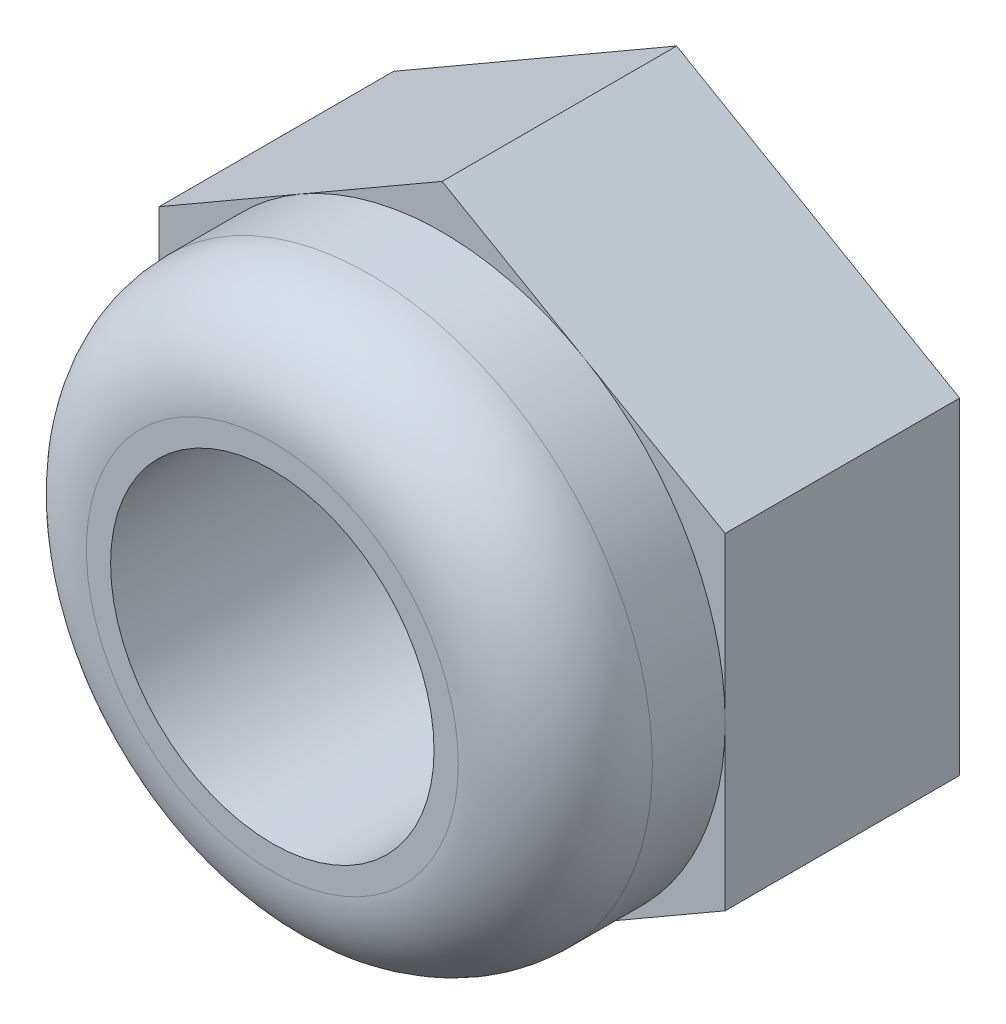
ISO-10303-21;
HEADER;
FILE_DESCRIPTION(('STEP AP214'),'2;1');
FILE_NAME('part.step','',(''),(''),'','','');
FILE_SCHEMA(('AUTOMOTIVE_DESIGN { 1 0 10303 214 1 1 1 1 }'));
ENDSEC;
DATA;
#1=APPLICATION_CONTEXT('core data for automotive mechanical design processes');
#2=APPLICATION_PROTOCOL_DEFINITION('international standard','automotive_design',2000,#1);
#3=PRODUCT_CONTEXT('',#1,'mechanical');
#4=PRODUCT('Part','Part','',(#3));
#5=PRODUCT_RELATED_PRODUCT_CATEGORY('part','',(#4));
#6=PRODUCT_DEFINITION_FORMATION('','',#4);
#7=PRODUCT_DEFINITION_CONTEXT('part definition',#1,'design');
#8=PRODUCT_DEFINITION('design','',#6,#7);
#9=PRODUCT_DEFINITION_SHAPE('','',#8);
#10=(LENGTH_UNIT() NAMED_UNIT(*) SI_UNIT(.MILLI.,.METRE.));
#11=(NAMED_UNIT(*) PLANE_ANGLE_UNIT() SI_UNIT($,.RADIAN.));
#12=(NAMED_UNIT(*) SI_UNIT($,.STERADIAN.) SOLID_ANGLE_UNIT());
#13=UNCERTAINTY_MEASURE_WITH_UNIT(LENGTH_MEASURE(1.E-05),#10,'distance_accuracy_value','');
#14=(GEOMETRIC_REPRESENTATION_CONTEXT(3) GLOBAL_UNCERTAINTY_ASSIGNED_CONTEXT((#13)) GLOBAL_UNIT_ASSIGNED_CONTEXT((#10,
#11,#12)) REPRESENTATION_CONTEXT('',''));
#15=CARTESIAN_POINT('',(0.,0.,0.));
#16=DIRECTION('',(0.,0.,1.));
#17=DIRECTION('',(1.,0.,0.));
#18=AXIS2_PLACEMENT_3D('',#15,#16,#17);
#19=CARTESIAN_POINT('',(0.,0.,2.9));
#20=DIRECTION('',(0.,0.,1.));
#21=DIRECTION('',(1.,0.,0.));
#22=AXIS2_PLACEMENT_3D('',#19,#20,#21);
#23=PLANE('',#22);
#24=CARTESIAN_POINT('',(0.,0.,2.9));
#25=DIRECTION('',(0.,0.,1.));
#26=DIRECTION('',(1.,0.,0.));
#27=AXIS2_PLACEMENT_3D('',#24,#25,#26);
#28=CIRCLE('',#27,3.5);
#29=CARTESIAN_POINT('',(3.5,0.,2.9));
#30=VERTEX_POINT('',#29);
#31=CARTESIAN_POINT('',(1.75,3.03108891324554,2.9));
#32=VERTEX_POINT('',#31);
#33=EDGE_CURVE('E132',#30,#32,#28,.T.);
#34=ORIENTED_EDGE('',*,*,#33,.F.);
#35=DIRECTION('',(0.,1.,0.));
#36=VECTOR('',#35,1.);
#37=CARTESIAN_POINT('',(3.5,-2.02072594216369,2.9));
#38=LINE('',#37,#36);
#39=CARTESIAN_POINT('',(3.5,2.02072594216369,2.9));
#40=VERTEX_POINT('',#39);
#41=EDGE_CURVE('E120',#30,#40,#38,.T.);
#42=ORIENTED_EDGE('',*,*,#41,.T.);
#43=DIRECTION('',(-0.866025403784439,0.5,0.));
#44=VECTOR('',#43,1.);
#45=CARTESIAN_POINT('',(3.5,2.02072594216369,2.9));
#46=LINE('',#45,#44);
#47=EDGE_CURVE('E133',#40,#32,#46,.T.);
#48=ORIENTED_EDGE('',*,*,#47,.T.);
#49=EDGE_LOOP('',(#34,#42,#48));
#50=FACE_BOUND('',#49,.T.);
#51=ADVANCED_FACE('F37',(#50),#23,.T.);
#52=CARTESIAN_POINT('',(-1.75,3.03108891324554,2.9));
#53=VERTEX_POINT('',#52);
#54=EDGE_CURVE('E139',#32,#53,#28,.T.);
#55=ORIENTED_EDGE('',*,*,#54,.F.);
#56=CARTESIAN_POINT('',(0.,4.04145188432738,2.9));
#57=VERTEX_POINT('',#56);
#58=EDGE_CURVE('E119',#32,#57,#46,.T.);
#59=ORIENTED_EDGE('',*,*,#58,.T.);
#60=DIRECTION('',(-0.866025403784439,-0.5,0.));
#61=VECTOR('',#60,1.);
#62=CARTESIAN_POINT('',(0.,4.04145188432738,2.9));
#63=LINE('',#62,#61);
#64=EDGE_CURVE('E150',#57,#53,#63,.T.);
#65=ORIENTED_EDGE('',*,*,#64,.T.);
#66=EDGE_LOOP('',(#55,#59,#65));
#67=FACE_BOUND('',#66,.T.);
#68=ADVANCED_FACE('F198',(#67),#23,.T.);
#69=CARTESIAN_POINT('',(-3.5,0.,2.9));
#70=VERTEX_POINT('',#69);
#71=EDGE_CURVE('E187',#53,#70,#28,.T.);
#72=ORIENTED_EDGE('',*,*,#71,.F.);
#73=CARTESIAN_POINT('',(-3.5,2.02072594216369,2.9));
#74=VERTEX_POINT('',#73);
#75=EDGE_CURVE('E149',#53,#74,#63,.T.);
#76=ORIENTED_EDGE('',*,*,#75,.T.);
#77=DIRECTION('',(0.,-1.,0.));
#78=VECTOR('',#77,1.);
#79=CARTESIAN_POINT('',(-3.5,2.02072594216369,2.9));
#80=LINE('',#79,#78);
#81=EDGE_CURVE('E154',#74,#70,#80,.T.);
#82=ORIENTED_EDGE('',*,*,#81,.T.);
#83=EDGE_LOOP('',(#72,#76,#82));
#84=FACE_BOUND('',#83,.T.);
#85=ADVANCED_FACE('F191',(#84),#23,.T.);
#86=CARTESIAN_POINT('',(-1.75,-3.03108891324554,2.9));
#87=VERTEX_POINT('',#86);
#88=EDGE_CURVE('E60',#70,#87,#28,.T.);
#89=ORIENTED_EDGE('',*,*,#88,.F.);
#90=CARTESIAN_POINT('',(-3.5,-2.02072594216369,2.9));
#91=VERTEX_POINT('',#90);
#92=EDGE_CURVE('E153',#70,#91,#80,.T.);
#93=ORIENTED_EDGE('',*,*,#92,.T.);
#94=DIRECTION('',(0.866025403784438,-0.5,0.));
#95=VECTOR('',#94,1.);
#96=CARTESIAN_POINT('',(-3.5,-2.02072594216369,2.9));
#97=LINE('',#96,#95);
#98=EDGE_CURVE('E158',#91,#87,#97,.T.);
#99=ORIENTED_EDGE('',*,*,#98,.T.);
#100=EDGE_LOOP('',(#89,#93,#99));
#101=FACE_BOUND('',#100,.T.);
#102=ADVANCED_FACE('F217',(#101),#23,.T.);
#103=CARTESIAN_POINT('',(1.75,-3.03108891324553,2.9));
#104=VERTEX_POINT('',#103);
#105=EDGE_CURVE('E52',#87,#104,#28,.T.);
#106=ORIENTED_EDGE('',*,*,#105,.F.);
#107=CARTESIAN_POINT('',(0.,-4.04145188432738,2.9));
#108=VERTEX_POINT('',#107);
#109=EDGE_CURVE('E157',#87,#108,#97,.T.);
#110=ORIENTED_EDGE('',*,*,#109,.T.);
#111=DIRECTION('',(0.866025403784438,0.5,0.));
#112=VECTOR('',#111,1.);
#113=CARTESIAN_POINT('',(0.,-4.04145188432738,2.9));
#114=LINE('',#113,#112);
#115=EDGE_CURVE('E130',#108,#104,#114,.T.);
#116=ORIENTED_EDGE('',*,*,#115,.T.);
#117=EDGE_LOOP('',(#106,#110,#116));
#118=FACE_BOUND('',#117,.T.);
#119=ADVANCED_FACE('F219',(#118),#23,.T.);
#120=CARTESIAN_POINT('',(0.,-4.04145188432738,2.9));
#121=DIRECTION('',(-0.5,0.866025403784439,0.));
#122=DIRECTION('',(-0.866025403784439,-0.5,0.));
#123=AXIS2_PLACEMENT_3D('',#120,#121,#122);
#124=PLANE('',#123);
#125=DIRECTION('',(0.866025403784438,0.5,0.));
#126=VECTOR('',#125,1.);
#127=CARTESIAN_POINT('',(0.,-4.04145188432738,0.));
#128=LINE('',#127,#126);
#129=CARTESIAN_POINT('',(0.,-4.04145188432738,0.));
#130=VERTEX_POINT('',#129);
#131=CARTESIAN_POINT('',(3.5,-2.02072594216369,0.));
#132=VERTEX_POINT('',#131);
#133=EDGE_CURVE('E136',#130,#132,#128,.T.);
#134=ORIENTED_EDGE('',*,*,#133,.T.);
#135=DIRECTION('',(0.,0.,-1.));
#136=VECTOR('',#135,1.);
#137=CARTESIAN_POINT('',(3.5,-2.02072594216369,2.9));
#138=LINE('',#137,#136);
#139=CARTESIAN_POINT('',(3.5,-2.02072594216369,2.9));
#140=VERTEX_POINT('',#139);
#141=EDGE_CURVE('E141',#140,#132,#138,.T.);
#142=ORIENTED_EDGE('',*,*,#141,.F.);
#143=EDGE_CURVE('E115',#104,#140,#114,.T.);
#144=ORIENTED_EDGE('',*,*,#143,.F.);
#145=ORIENTED_EDGE('',*,*,#115,.F.);
#146=DIRECTION('',(0.,0.,-1.));
#147=VECTOR('',#146,1.);
#148=CARTESIAN_POINT('',(0.,-4.04145188432738,2.9));
#149=LINE('',#148,#147);
#150=EDGE_CURVE('E160',#108,#130,#149,.T.);
#151=ORIENTED_EDGE('',*,*,#150,.T.);
#152=EDGE_LOOP('',(#134,#142,#144,#145,#151));
#153=FACE_BOUND('',#152,.T.);
#154=ADVANCED_FACE('F225',(#153),#124,.F.);
#155=CARTESIAN_POINT('',(3.5,-2.02072594216369,2.9));
#156=DIRECTION('',(-1.,0.,0.));
#157=DIRECTION('',(0.,-1.,0.));
#158=AXIS2_PLACEMENT_3D('',#155,#156,#157);
#159=PLANE('',#158);
#160=DIRECTION('',(0.,1.,0.));
#161=VECTOR('',#160,1.);
#162=CARTESIAN_POINT('',(3.5,-2.02072594216369,0.));
#163=LINE('',#162,#161);
#164=CARTESIAN_POINT('',(3.5,2.02072594216369,0.));
#165=VERTEX_POINT('',#164);
#166=EDGE_CURVE('E163',#132,#165,#163,.T.);
#167=ORIENTED_EDGE('',*,*,#166,.T.);
#168=DIRECTION('',(0.,0.,-1.));
#169=VECTOR('',#168,1.);
#170=CARTESIAN_POINT('',(3.5,2.02072594216369,2.9));
#171=LINE('',#170,#169);
#172=EDGE_CURVE('E126',#40,#165,#171,.T.);
#173=ORIENTED_EDGE('',*,*,#172,.F.);
#174=ORIENTED_EDGE('',*,*,#41,.F.);
#175=EDGE_CURVE('E109',#140,#30,#38,.T.);
#176=ORIENTED_EDGE('',*,*,#175,.F.);
#177=ORIENTED_EDGE('',*,*,#141,.T.);
#178=EDGE_LOOP('',(#167,#173,#174,#176,#177));
#179=FACE_BOUND('',#178,.T.);
#180=ADVANCED_FACE('F124',(#179),#159,.F.);
#181=CARTESIAN_POINT('',(3.5,2.02072594216369,2.9));
#182=DIRECTION('',(-0.5,-0.866025403784439,0.));
#183=DIRECTION('',(0.866025403784439,-0.5,0.));
#184=AXIS2_PLACEMENT_3D('',#181,#182,#183);
#185=PLANE('',#184);
#186=DIRECTION('',(-0.866025403784439,0.5,0.));
#187=VECTOR('',#186,1.);
#188=CARTESIAN_POINT('',(3.5,2.02072594216369,0.));
#189=LINE('',#188,#187);
#190=CARTESIAN_POINT('',(0.,4.04145188432738,0.));
#191=VERTEX_POINT('',#190);
#192=EDGE_CURVE('E165',#165,#191,#189,.T.);
#193=ORIENTED_EDGE('',*,*,#192,.T.);
#194=DIRECTION('',(0.,0.,-1.));
#195=VECTOR('',#194,1.);
#196=CARTESIAN_POINT('',(0.,4.04145188432738,2.9));
#197=LINE('',#196,#195);
#198=EDGE_CURVE('E181',#57,#191,#197,.T.);
#199=ORIENTED_EDGE('',*,*,#198,.F.);
#200=ORIENTED_EDGE('',*,*,#58,.F.);
#201=ORIENTED_EDGE('',*,*,#47,.F.);
#202=ORIENTED_EDGE('',*,*,#172,.T.);
#203=EDGE_LOOP('',(#193,#199,#200,#201,#202));
#204=FACE_BOUND('',#203,.T.);
#205=ADVANCED_FACE('F202',(#204),#185,.F.);
#206=CARTESIAN_POINT('',(0.,4.04145188432738,2.9));
#207=DIRECTION('',(0.5,-0.866025403784439,0.));
#208=DIRECTION('',(0.866025403784439,0.5,0.));
#209=AXIS2_PLACEMENT_3D('',#206,#207,#208);
#210=PLANE('',#209);
#211=DIRECTION('',(-0.866025403784439,-0.5,0.));
#212=VECTOR('',#211,1.);
#213=CARTESIAN_POINT('',(0.,4.04145188432738,0.));
#214=LINE('',#213,#212);
#215=CARTESIAN_POINT('',(-3.5,2.02072594216369,0.));
#216=VERTEX_POINT('',#215);
#217=EDGE_CURVE('E167',#191,#216,#214,.T.);
#218=ORIENTED_EDGE('',*,*,#217,.T.);
#219=DIRECTION('',(0.,0.,-1.));
#220=VECTOR('',#219,1.);
#221=CARTESIAN_POINT('',(-3.5,2.02072594216369,2.9));
#222=LINE('',#221,#220);
#223=EDGE_CURVE('E178',#74,#216,#222,.T.);
#224=ORIENTED_EDGE('',*,*,#223,.F.);
#225=ORIENTED_EDGE('',*,*,#75,.F.);
#226=ORIENTED_EDGE('',*,*,#64,.F.);
#227=ORIENTED_EDGE('',*,*,#198,.T.);
#228=EDGE_LOOP('',(#218,#224,#225,#226,#227));
#229=FACE_BOUND('',#228,.T.);
#230=ADVANCED_FACE('F196',(#229),#210,.F.);
#231=CARTESIAN_POINT('',(-3.5,2.02072594216369,2.9));
#232=DIRECTION('',(1.,0.,0.));
#233=DIRECTION('',(0.,1.,0.));
#234=AXIS2_PLACEMENT_3D('',#231,#232,#233);
#235=PLANE('',#234);
#236=DIRECTION('',(0.,-1.,0.));
#237=VECTOR('',#236,1.);
#238=CARTESIAN_POINT('',(-3.5,2.02072594216369,0.));
#239=LINE('',#238,#237);
#240=CARTESIAN_POINT('',(-3.5,-2.02072594216369,0.));
#241=VERTEX_POINT('',#240);
#242=EDGE_CURVE('E169',#216,#241,#239,.T.);
#243=ORIENTED_EDGE('',*,*,#242,.T.);
#244=DIRECTION('',(0.,0.,-1.));
#245=VECTOR('',#244,1.);
#246=CARTESIAN_POINT('',(-3.5,-2.02072594216369,2.9));
#247=LINE('',#246,#245);
#248=EDGE_CURVE('E175',#91,#241,#247,.T.);
#249=ORIENTED_EDGE('',*,*,#248,.F.);
#250=ORIENTED_EDGE('',*,*,#92,.F.);
#251=ORIENTED_EDGE('',*,*,#81,.F.);
#252=ORIENTED_EDGE('',*,*,#223,.T.);
#253=EDGE_LOOP('',(#243,#249,#250,#251,#252));
#254=FACE_BOUND('',#253,.T.);
#255=ADVANCED_FACE('F212',(#254),#235,.F.);
#256=CARTESIAN_POINT('',(-3.5,-2.02072594216369,2.9));
#257=DIRECTION('',(0.5,0.866025403784439,0.));
#258=DIRECTION('',(-0.866025403784439,0.5,0.));
#259=AXIS2_PLACEMENT_3D('',#256,#257,#258);
#260=PLANE('',#259);
#261=DIRECTION('',(0.866025403784438,-0.5,0.));
#262=VECTOR('',#261,1.);
#263=CARTESIAN_POINT('',(-3.5,-2.02072594216369,0.));
#264=LINE('',#263,#262);
#265=EDGE_CURVE('E171',#241,#130,#264,.T.);
#266=ORIENTED_EDGE('',*,*,#265,.T.);
#267=ORIENTED_EDGE('',*,*,#150,.F.);
#268=ORIENTED_EDGE('',*,*,#109,.F.);
#269=ORIENTED_EDGE('',*,*,#98,.F.);
#270=ORIENTED_EDGE('',*,*,#248,.T.);
#271=EDGE_LOOP('',(#266,#267,#268,#269,#270));
#272=FACE_BOUND('',#271,.T.);
#273=ADVANCED_FACE('F215',(#272),#260,.F.);
#274=EDGE_CURVE('E113',#104,#30,#28,.T.);
#275=ORIENTED_EDGE('',*,*,#274,.F.);
#276=ORIENTED_EDGE('',*,*,#143,.T.);
#277=ORIENTED_EDGE('',*,*,#175,.T.);
#278=EDGE_LOOP('',(#275,#276,#277));
#279=FACE_BOUND('',#278,.T.);
#280=ADVANCED_FACE('F111',(#279),#23,.T.);
#281=CARTESIAN_POINT('',(0.,0.,0.));
#282=DIRECTION('',(0.,0.,1.));
#283=DIRECTION('',(1.,0.,0.));
#284=AXIS2_PLACEMENT_3D('',#281,#282,#283);
#285=PLANE('',#284);
#286=CARTESIAN_POINT('',(0.,0.,0.));
#287=DIRECTION('',(0.,0.,1.));
#288=DIRECTION('',(1.,0.,0.));
#289=AXIS2_PLACEMENT_3D('',#286,#287,#288);
#290=CIRCLE('',#289,2.);
#291=CARTESIAN_POINT('',(2.,0.,0.));
#292=VERTEX_POINT('',#291);
#293=EDGE_CURVE('E137',#292,#292,#290,.T.);
#294=ORIENTED_EDGE('',*,*,#293,.T.);
#295=EDGE_LOOP('',(#294));
#296=FACE_BOUND('',#295,.T.);
#297=ORIENTED_EDGE('',*,*,#133,.F.);
#298=ORIENTED_EDGE('',*,*,#265,.F.);
#299=ORIENTED_EDGE('',*,*,#242,.F.);
#300=ORIENTED_EDGE('',*,*,#217,.F.);
#301=ORIENTED_EDGE('',*,*,#192,.F.);
#302=ORIENTED_EDGE('',*,*,#166,.F.);
#303=EDGE_LOOP('',(#297,#298,#299,#300,#301,#302));
#304=FACE_BOUND('',#303,.T.);
#305=ADVANCED_FACE('F208',(#296,#304),#285,.F.);
#306=CARTESIAN_POINT('',(0.,0.,5.));
#307=DIRECTION('',(0.,0.,-1.));
#308=DIRECTION('',(-1.,0.,0.));
#309=AXIS2_PLACEMENT_3D('',#306,#307,#308);
#310=CYLINDRICAL_SURFACE('',#309,3.5);
#311=CARTESIAN_POINT('',(0.,0.,3.8));
#312=DIRECTION('',(0.,0.,1.));
#313=DIRECTION('',(1.,0.,0.));
#314=AXIS2_PLACEMENT_3D('',#311,#312,#313);
#315=CIRCLE('',#314,3.5);
#316=CARTESIAN_POINT('',(3.5,0.,3.8));
#317=VERTEX_POINT('',#316);
#318=EDGE_CURVE('E11',#317,#317,#315,.F.);
#319=ORIENTED_EDGE('',*,*,#318,.T.);
#320=EDGE_LOOP('',(#319));
#321=FACE_BOUND('',#320,.T.);
#322=ORIENTED_EDGE('',*,*,#33,.T.);
#323=ORIENTED_EDGE('',*,*,#54,.T.);
#324=ORIENTED_EDGE('',*,*,#71,.T.);
#325=ORIENTED_EDGE('',*,*,#88,.T.);
#326=ORIENTED_EDGE('',*,*,#105,.T.);
#327=ORIENTED_EDGE('',*,*,#274,.T.);
#328=EDGE_LOOP('',(#322,#323,#324,#325,#326,#327));
#329=FACE_BOUND('',#328,.T.);
#330=ADVANCED_FACE('F140',(#321,#329),#310,.T.);
#331=CARTESIAN_POINT('',(0.,0.,5.));
#332=DIRECTION('',(0.,0.,1.));
#333=DIRECTION('',(1.,0.,0.));
#334=AXIS2_PLACEMENT_3D('',#331,#332,#333);
#335=PLANE('',#334);
#336=CARTESIAN_POINT('',(0.,0.,5.));
#337=DIRECTION('',(0.,0.,1.));
#338=DIRECTION('',(1.,0.,0.));
#339=AXIS2_PLACEMENT_3D('',#336,#337,#338);
#340=CIRCLE('',#339,2.3);
#341=CARTESIAN_POINT('',(2.3,0.,5.));
#342=VERTEX_POINT('',#341);
#343=EDGE_CURVE('E45',#342,#342,#340,.T.);
#344=ORIENTED_EDGE('',*,*,#343,.T.);
#345=EDGE_LOOP('',(#344));
#346=FACE_BOUND('',#345,.T.);
#347=CARTESIAN_POINT('',(0.,0.,5.));
#348=DIRECTION('',(0.,0.,1.));
#349=DIRECTION('',(1.,0.,0.));
#350=AXIS2_PLACEMENT_3D('',#347,#348,#349);
#351=CIRCLE('',#350,2.);
#352=CARTESIAN_POINT('',(2.,0.,5.));
#353=VERTEX_POINT('',#352);
#354=EDGE_CURVE('E145',#353,#353,#351,.T.);
#355=ORIENTED_EDGE('',*,*,#354,.F.);
#356=EDGE_LOOP('',(#355));
#357=FACE_BOUND('',#356,.T.);
#358=ADVANCED_FACE('F298',(#346,#357),#335,.T.);
#359=CARTESIAN_POINT('',(0.,0.,0.));
#360=DIRECTION('',(0.,0.,1.));
#361=DIRECTION('',(1.,0.,0.));
#362=AXIS2_PLACEMENT_3D('',#359,#360,#361);
#363=CYLINDRICAL_SURFACE('',#362,2.);
#364=ORIENTED_EDGE('',*,*,#293,.F.);
#365=EDGE_LOOP('',(#364));
#366=FACE_BOUND('',#365,.T.);
#367=ORIENTED_EDGE('',*,*,#354,.T.);
#368=EDGE_LOOP('',(#367));
#369=FACE_BOUND('',#368,.T.);
#370=ADVANCED_FACE('F293',(#366,#369),#363,.F.);
#371=CARTESIAN_POINT('',(0.,0.,3.8));
#372=DIRECTION('',(0.,0.,1.));
#373=DIRECTION('',(1.,0.,0.));
#374=AXIS2_PLACEMENT_3D('',#371,#372,#373);
#375=TOROIDAL_SURFACE('',#374,2.3,1.2);
#376=ORIENTED_EDGE('',*,*,#318,.F.);
#377=EDGE_LOOP('',(#376));
#378=FACE_BOUND('',#377,.T.);
#379=ORIENTED_EDGE('',*,*,#343,.F.);
#380=EDGE_LOOP('',(#379));
#381=FACE_BOUND('',#380,.T.);
#382=ADVANCED_FACE('F39',(#378,#381),#375,.T.);
#383=CLOSED_SHELL('',(#51,#68,#85,#102,#119,#154,#180,#205,#230,#255,#273,#280,#305,#330,#358,
#370,#382));
#384=MANIFOLD_SOLID_BREP('B2',#383);
#385=ADVANCED_BREP_SHAPE_REPRESENTATION('',(#18,#384),#14);
#386=SHAPE_DEFINITION_REPRESENTATION(#9,#385);
ENDSEC;
END-ISO-10303-21;
